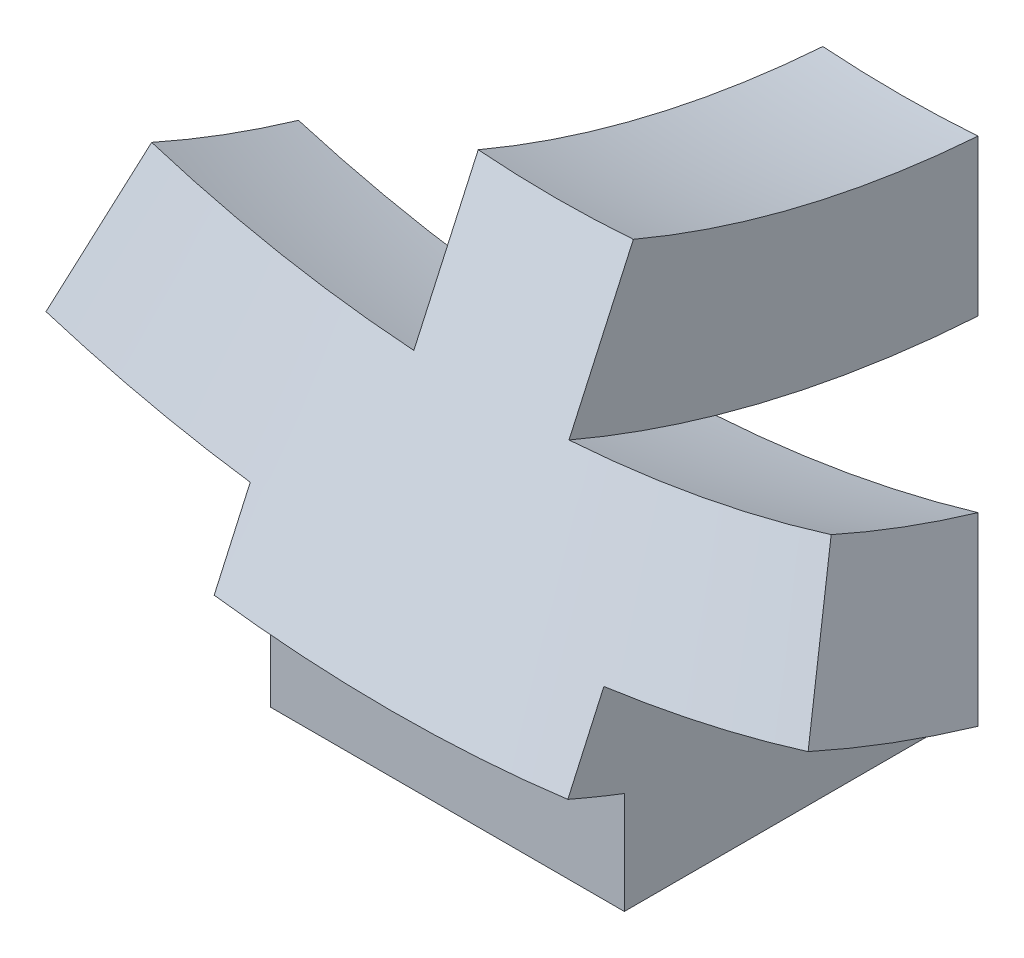
ISO-10303-21;
HEADER;
FILE_DESCRIPTION(('STEP AP214'),'2;1');
FILE_NAME('part.step','',(''),(''),'','','');
FILE_SCHEMA(('AUTOMOTIVE_DESIGN { 1 0 10303 214 1 1 1 1 }'));
ENDSEC;
DATA;
#1=APPLICATION_CONTEXT('core data for automotive mechanical design processes');
#2=APPLICATION_PROTOCOL_DEFINITION('international standard','automotive_design',2000,#1);
#3=PRODUCT_CONTEXT('',#1,'mechanical');
#4=PRODUCT('Part','Part','',(#3));
#5=PRODUCT_RELATED_PRODUCT_CATEGORY('part','',(#4));
#6=PRODUCT_DEFINITION_FORMATION('','',#4);
#7=PRODUCT_DEFINITION_CONTEXT('part definition',#1,'design');
#8=PRODUCT_DEFINITION('design','',#6,#7);
#9=PRODUCT_DEFINITION_SHAPE('','',#8);
#10=(LENGTH_UNIT() NAMED_UNIT(*) SI_UNIT(.MILLI.,.METRE.));
#11=(NAMED_UNIT(*) PLANE_ANGLE_UNIT() SI_UNIT($,.RADIAN.));
#12=(NAMED_UNIT(*) SI_UNIT($,.STERADIAN.) SOLID_ANGLE_UNIT());
#13=UNCERTAINTY_MEASURE_WITH_UNIT(LENGTH_MEASURE(1.E-05),#10,'distance_accuracy_value','');
#14=(GEOMETRIC_REPRESENTATION_CONTEXT(3) GLOBAL_UNCERTAINTY_ASSIGNED_CONTEXT((#13)) GLOBAL_UNIT_ASSIGNED_CONTEXT((#10,
#11,#12)) REPRESENTATION_CONTEXT('',''));
#15=CARTESIAN_POINT('',(0.,0.,0.));
#16=DIRECTION('',(0.,0.,1.));
#17=DIRECTION('',(1.,0.,0.));
#18=AXIS2_PLACEMENT_3D('',#15,#16,#17);
#19=CARTESIAN_POINT('',(0.,0.,0.));
#20=DIRECTION('',(0.,0.,1.));
#21=DIRECTION('',(1.,0.,0.));
#22=AXIS2_PLACEMENT_3D('',#19,#20,#21);
#23=SPHERICAL_SURFACE('',#22,30.7476736735782);
#24=CARTESIAN_POINT('',(-3.8947960584419,0.,0.));
#25=DIRECTION('',(-1.,0.,0.));
#26=DIRECTION('',(0.,-1.,0.));
#27=AXIS2_PLACEMENT_3D('',#24,#25,#26);
#28=CIRCLE('',#27,30.5);
#29=CARTESIAN_POINT('',(-3.89479605844179,-30.2502985714711,3.8947960584418));
#30=VERTEX_POINT('',#29);
#31=CARTESIAN_POINT('',(-3.8947960584418,-29.3224571664811,8.39306295221711));
#32=VERTEX_POINT('',#31);
#33=EDGE_CURVE('E49',#30,#32,#28,.T.);
#34=ORIENTED_EDGE('',*,*,#33,.T.);
#35=CARTESIAN_POINT('',(0.,0.,8.39306295221722));
#36=DIRECTION('',(0.,0.,1.));
#37=DIRECTION('',(-1.,0.,0.));
#38=AXIS2_PLACEMENT_3D('',#35,#36,#37);
#39=CIRCLE('',#38,29.5799920658706);
#40=CARTESIAN_POINT('',(3.894796058442,-29.3224571664811,8.39306295221711));
#41=VERTEX_POINT('',#40);
#42=EDGE_CURVE('E143',#32,#41,#39,.T.);
#43=ORIENTED_EDGE('',*,*,#42,.T.);
#44=CARTESIAN_POINT('',(3.8947960584419,0.,0.));
#45=DIRECTION('',(-1.,0.,0.));
#46=DIRECTION('',(0.,-1.,0.));
#47=AXIS2_PLACEMENT_3D('',#44,#45,#46);
#48=CIRCLE('',#47,30.5);
#49=CARTESIAN_POINT('',(3.894796058442,-30.250298571471,3.8947960584418));
#50=VERTEX_POINT('',#49);
#51=EDGE_CURVE('E57',#50,#41,#48,.T.);
#52=ORIENTED_EDGE('',*,*,#51,.F.);
#53=CARTESIAN_POINT('',(0.,0.,3.8947960584419));
#54=DIRECTION('',(0.,0.,1.));
#55=DIRECTION('',(-1.,0.,0.));
#56=AXIS2_PLACEMENT_3D('',#53,#54,#55);
#57=CIRCLE('',#56,30.5);
#58=EDGE_CURVE('E41',#30,#50,#57,.T.);
#59=ORIENTED_EDGE('',*,*,#58,.F.);
#60=EDGE_LOOP('',(#34,#43,#52,#59));
#61=FACE_BOUND('',#60,.T.);
#62=ADVANCED_FACE('F37',(#61),#23,.F.);
#63=CARTESIAN_POINT('',(32.4999999999999,0.,3.894796058442));
#64=DIRECTION('',(0.,0.,1.));
#65=DIRECTION('',(-1.,0.,0.));
#66=AXIS2_PLACEMENT_3D('',#63,#64,#65);
#67=PLANE('',#66);
#68=DIRECTION('',(-1.,0.,0.));
#69=VECTOR('',#68,1.);
#70=CARTESIAN_POINT('',(-32.5,-32.5,3.89479605844188));
#71=LINE('',#70,#69);
#72=CARTESIAN_POINT('',(3.8947960584421,-32.5,3.8947960584418));
#73=VERTEX_POINT('',#72);
#74=CARTESIAN_POINT('',(-3.89479605844188,-32.5,3.8947960584418));
#75=VERTEX_POINT('',#74);
#76=EDGE_CURVE('E218',#73,#75,#71,.T.);
#77=ORIENTED_EDGE('',*,*,#76,.T.);
#78=DIRECTION('',(0.,-1.,0.));
#79=VECTOR('',#78,1.);
#80=CARTESIAN_POINT('',(-3.89479605844199,-1.45716771982052E-13,3.89479605844199));
#81=LINE('',#80,#79);
#82=EDGE_CURVE('E201',#30,#75,#81,.T.);
#83=ORIENTED_EDGE('',*,*,#82,.F.);
#84=ORIENTED_EDGE('',*,*,#58,.T.);
#85=DIRECTION('',(0.,1.,0.));
#86=VECTOR('',#85,1.);
#87=CARTESIAN_POINT('',(3.89479605844199,-1.17961196366423E-13,3.894796058442));
#88=LINE('',#87,#86);
#89=EDGE_CURVE('E358',#73,#50,#88,.T.);
#90=ORIENTED_EDGE('',*,*,#89,.F.);
#91=EDGE_LOOP('',(#77,#83,#84,#90));
#92=FACE_BOUND('',#91,.T.);
#93=ADVANCED_FACE('F265',(#92),#67,.F.);
#94=CARTESIAN_POINT('',(0.,0.,7.48329222234973));
#95=DIRECTION('',(0.,0.,1.));
#96=DIRECTION('',(-1.,0.,0.));
#97=AXIS2_PLACEMENT_3D('',#94,#95,#96);
#98=CONICAL_SURFACE('',#97,26.2857240675938,1.30134475047002);
#99=CARTESIAN_POINT('',(0.,0.,7.48329222234973));
#100=DIRECTION('',(0.,0.,1.));
#101=DIRECTION('',(-1.,0.,0.));
#102=AXIS2_PLACEMENT_3D('',#99,#100,#101);
#103=CIRCLE('',#102,26.2857240675938);
#104=CARTESIAN_POINT('',(-7.48329222234964,-25.1980083989311,7.48329222234964));
#105=VERTEX_POINT('',#104);
#106=CARTESIAN_POINT('',(-1.70874488464016,-26.2301254415014,7.48329222234964));
#107=VERTEX_POINT('',#106);
#108=EDGE_CURVE('E139',#105,#107,#103,.T.);
#109=ORIENTED_EDGE('',*,*,#108,.T.);
#110=CARTESIAN_POINT('',(1.70874488464034,-26.2301254415014,7.48329222234964));
#111=VERTEX_POINT('',#110);
#112=EDGE_CURVE('E142',#107,#111,#103,.T.);
#113=ORIENTED_EDGE('',*,*,#112,.T.);
#114=CARTESIAN_POINT('',(7.48329222234981,-25.1980083989311,7.48329222234964));
#115=VERTEX_POINT('',#114);
#116=EDGE_CURVE('E140',#111,#115,#103,.T.);
#117=ORIENTED_EDGE('',*,*,#116,.T.);
#118=CARTESIAN_POINT('',(8.39326295221731,-28.3649768493335,8.39326295221712));
#119=CARTESIAN_POINT('',(8.24156724531615,-27.837033100136,8.24156724531596));
#120=CARTESIAN_POINT('',(8.08987183104328,-27.3090891827758,8.08987183104309));
#121=CARTESIAN_POINT('',(7.78648158775411,-26.2532010117296,7.78648158775393));
#122=CARTESIAN_POINT('',(7.63478675873782,-25.7252567580436,7.63478675873764));
#123=CARTESIAN_POINT('',(7.48309222234982,-25.1973123361948,7.48309222234965));
#124=B_SPLINE_CURVE_WITH_KNOTS('',3,(#118,#119,#120,#121,#122,#123),.UNSPECIFIED.,.F.,.F.,(4,2,
4),(0.,1.70959936701698,3.41919873403409),.UNSPECIFIED.);
#125=CARTESIAN_POINT('',(8.39306295221731,-28.3642807928756,8.39306295221712));
#126=VERTEX_POINT('',#125);
#127=EDGE_CURVE('E202',#126,#115,#124,.T.);
#128=ORIENTED_EDGE('',*,*,#127,.F.);
#129=EDGE_CURVE('E151',#41,#126,#39,.T.);
#130=ORIENTED_EDGE('',*,*,#129,.F.);
#131=ORIENTED_EDGE('',*,*,#42,.F.);
#132=CARTESIAN_POINT('',(-8.39306295221712,-28.3642807928756,8.39306295221711));
#133=VERTEX_POINT('',#132);
#134=EDGE_CURVE('E152',#133,#32,#39,.T.);
#135=ORIENTED_EDGE('',*,*,#134,.F.);
#136=CARTESIAN_POINT('',(-7.48309222234964,-25.1973123361948,7.48309222234964));
#137=CARTESIAN_POINT('',(-7.63478675873763,-25.7252567580436,7.63478675873763));
#138=CARTESIAN_POINT('',(-7.78648158775392,-26.2532010117296,7.78648158775392));
#139=CARTESIAN_POINT('',(-8.08987183104308,-27.3090891827758,8.08987183104308));
#140=CARTESIAN_POINT('',(-8.24156724531595,-27.8370331001361,8.24156724531595));
#141=CARTESIAN_POINT('',(-8.39326295221711,-28.3649768493335,8.39326295221711));
#142=B_SPLINE_CURVE_WITH_KNOTS('',3,(#136,#137,#138,#139,#140,#141),.UNSPECIFIED.,.F.,.F.,(4,2,
4),(0.,1.7095993670171,3.41919873403409),.UNSPECIFIED.);
#143=EDGE_CURVE('E165',#105,#133,#142,.T.);
#144=ORIENTED_EDGE('',*,*,#143,.F.);
#145=EDGE_LOOP('',(#109,#113,#117,#128,#130,#131,#135,#144));
#146=FACE_BOUND('',#145,.T.);
#147=ADVANCED_FACE('F158',(#146),#98,.T.);
#148=CARTESIAN_POINT('',(0.,0.,0.));
#149=DIRECTION('',(0.,0.,1.));
#150=DIRECTION('',(1.,0.,0.));
#151=AXIS2_PLACEMENT_3D('',#148,#149,#150);
#152=SPHERICAL_SURFACE('',#151,27.3301839042982);
#153=CARTESIAN_POINT('',(0.,0.,1.70874488464027));
#154=DIRECTION('',(0.,0.,1.));
#155=DIRECTION('',(-1.,0.,0.));
#156=AXIS2_PLACEMENT_3D('',#153,#154,#155);
#157=CIRCLE('',#156,27.276714302899);
#158=CARTESIAN_POINT('',(-1.70874488464015,-27.2231396808155,1.70874488464017));
#159=VERTEX_POINT('',#158);
#160=CARTESIAN_POINT('',(1.70874488464035,-27.2231396808155,1.70874488464017));
#161=VERTEX_POINT('',#160);
#162=EDGE_CURVE('E137',#159,#161,#157,.T.);
#163=ORIENTED_EDGE('',*,*,#162,.T.);
#164=CARTESIAN_POINT('',(1.70874488464026,0.,0.));
#165=DIRECTION('',(1.,0.,0.));
#166=DIRECTION('',(0.,1.,0.));
#167=AXIS2_PLACEMENT_3D('',#164,#165,#166);
#168=CIRCLE('',#167,27.2767143028991);
#169=EDGE_CURVE('E183',#111,#161,#168,.T.);
#170=ORIENTED_EDGE('',*,*,#169,.F.);
#171=ORIENTED_EDGE('',*,*,#112,.F.);
#172=CARTESIAN_POINT('',(-1.70874488464026,0.,0.));
#173=DIRECTION('',(-1.,0.,0.));
#174=DIRECTION('',(0.,-1.,0.));
#175=AXIS2_PLACEMENT_3D('',#172,#173,#174);
#176=CIRCLE('',#175,27.2767143028991);
#177=EDGE_CURVE('E173',#159,#107,#176,.T.);
#178=ORIENTED_EDGE('',*,*,#177,.F.);
#179=EDGE_LOOP('',(#163,#170,#171,#178));
#180=FACE_BOUND('',#179,.T.);
#181=ADVANCED_FACE('F186',(#180),#152,.T.);
#182=CARTESIAN_POINT('',(23.8515645548495,0.,1.70874488464026));
#183=DIRECTION('',(0.,0.,1.));
#184=DIRECTION('',(-1.,0.,0.));
#185=AXIS2_PLACEMENT_3D('',#182,#183,#184);
#186=PLANE('',#185);
#187=CARTESIAN_POINT('',(0.,0.,1.70874488464023));
#188=DIRECTION('',(0.,0.,1.));
#189=DIRECTION('',(-1.,0.,0.));
#190=AXIS2_PLACEMENT_3D('',#187,#188,#189);
#191=CIRCLE('',#190,23.8515645548495);
#192=CARTESIAN_POINT('',(-1.70874488464015,-23.7902779015582,1.70874488464015));
#193=VERTEX_POINT('',#192);
#194=CARTESIAN_POINT('',(1.70874488464033,-23.7902779015582,1.70874488464015));
#195=VERTEX_POINT('',#194);
#196=EDGE_CURVE('E126',#193,#195,#191,.T.);
#197=ORIENTED_EDGE('',*,*,#196,.T.);
#198=DIRECTION('',(0.,1.,0.));
#199=VECTOR('',#198,1.);
#200=CARTESIAN_POINT('',(1.70874488464026,0.,1.70874488464025));
#201=LINE('',#200,#199);
#202=EDGE_CURVE('E184',#161,#195,#201,.T.);
#203=ORIENTED_EDGE('',*,*,#202,.F.);
#204=ORIENTED_EDGE('',*,*,#162,.F.);
#205=DIRECTION('',(0.,-1.,0.));
#206=VECTOR('',#205,1.);
#207=CARTESIAN_POINT('',(-1.70874488464025,-1.07552855510562E-13,1.70874488464026));
#208=LINE('',#207,#206);
#209=EDGE_CURVE('E113',#193,#159,#208,.T.);
#210=ORIENTED_EDGE('',*,*,#209,.F.);
#211=EDGE_LOOP('',(#197,#203,#204,#210));
#212=FACE_BOUND('',#211,.T.);
#213=ADVANCED_FACE('F250',(#212),#186,.F.);
#214=CARTESIAN_POINT('',(3.89479605844189,32.5,0.));
#215=DIRECTION('',(1.,0.,0.));
#216=DIRECTION('',(0.,-1.,0.));
#217=AXIS2_PLACEMENT_3D('',#214,#215,#216);
#218=PLANE('',#217);
#219=DIRECTION('',(0.,0.,1.));
#220=VECTOR('',#219,1.);
#221=CARTESIAN_POINT('',(3.8947960584421,-32.5,-32.5));
#222=LINE('',#221,#220);
#223=CARTESIAN_POINT('',(3.8947960584421,-32.5,11.6843881753259));
#224=VERTEX_POINT('',#223);
#225=EDGE_CURVE('E215',#73,#224,#222,.T.);
#226=ORIENTED_EDGE('',*,*,#225,.F.);
#227=ORIENTED_EDGE('',*,*,#89,.T.);
#228=ORIENTED_EDGE('',*,*,#51,.T.);
#229=CARTESIAN_POINT('',(3.89479605844209,-27.9819524685902,12.1350869813756));
#230=VERTEX_POINT('',#229);
#231=EDGE_CURVE('E193',#41,#230,#48,.T.);
#232=ORIENTED_EDGE('',*,*,#231,.T.);
#233=CARTESIAN_POINT('',(3.89479605844211,-35.5699771913844,15.5675463428578));
#234=CARTESIAN_POINT('',(3.89479605844211,-34.2887705066438,14.9870911520035));
#235=CARTESIAN_POINT('',(3.8947960584421,-33.0074458102986,14.4068959176564));
#236=CARTESIAN_POINT('',(3.89479605844209,-30.4444005461586,13.2473845634315));
#237=CARTESIAN_POINT('',(3.89479605844209,-29.1626799788237,12.6680684425369));
#238=CARTESIAN_POINT('',(3.89479605844208,-26.5986790761798,11.5106726823728));
#239=CARTESIAN_POINT('',(3.89479605844208,-25.3163987403988,10.932593044148));
#240=CARTESIAN_POINT('',(3.89479605844207,-23.3923252593334,10.0669226868517));
#241=CARTESIAN_POINT('',(3.89479605844207,-22.750858232874,9.7786072520183));
#242=CARTESIAN_POINT('',(3.89479605844206,-21.4676400043882,9.20260894604725));
#243=CARTESIAN_POINT('',(3.89479605844206,-20.8258888022637,8.91492607512798));
#244=CARTESIAN_POINT('',(3.89479605844206,-20.1839623525351,8.62763429495572));
#245=B_SPLINE_CURVE_WITH_KNOTS('',3,(#233,#234,#235,#236,#237,#238,#239,#240,#241,#242,#243,
#244),.UNSPECIFIED.,.F.,.F.,(4,2,2,2,2,4),(0.,4.2196885581347,8.43937223157967,12.6590594690262,
14.7689055196008,16.878752298504),.UNSPECIFIED.);
#246=CARTESIAN_POINT('',(3.89479605844209,-29.7396392780992,12.929011806916));
#247=VERTEX_POINT('',#246);
#248=EDGE_CURVE('E129',#247,#230,#245,.T.);
#249=ORIENTED_EDGE('',*,*,#248,.F.);
#250=CARTESIAN_POINT('',(3.89479605844199,0.,0.));
#251=DIRECTION('',(1.,0.,0.));
#252=DIRECTION('',(0.,1.,0.));
#253=AXIS2_PLACEMENT_3D('',#250,#251,#252);
#254=CIRCLE('',#253,32.4284672887085);
#255=CARTESIAN_POINT('',(3.89479605844209,-30.250298571471,11.6843881753259));
#256=VERTEX_POINT('',#255);
#257=EDGE_CURVE('E105',#256,#247,#254,.F.);
#258=ORIENTED_EDGE('',*,*,#257,.F.);
#259=DIRECTION('',(0.,1.,0.));
#260=VECTOR('',#259,1.);
#261=CARTESIAN_POINT('',(3.89479605844199,-1.45716771982052E-13,11.6843881753261));
#262=LINE('',#261,#260);
#263=EDGE_CURVE('E117',#224,#256,#262,.T.);
#264=ORIENTED_EDGE('',*,*,#263,.F.);
#265=EDGE_LOOP('',(#226,#227,#228,#232,#249,#258,#264));
#266=FACE_BOUND('',#265,.T.);
#267=ADVANCED_FACE('F128',(#266),#218,.T.);
#268=CARTESIAN_POINT('',(-3.89479605844211,32.5,0.));
#269=DIRECTION('',(-1.,0.,0.));
#270=DIRECTION('',(0.,-1.,0.));
#271=AXIS2_PLACEMENT_3D('',#268,#269,#270);
#272=PLANE('',#271);
#273=DIRECTION('',(0.,0.,-1.));
#274=VECTOR('',#273,1.);
#275=CARTESIAN_POINT('',(-3.89479605844188,-32.5,-32.5));
#276=LINE('',#275,#274);
#277=CARTESIAN_POINT('',(-3.89479605844188,-32.5,11.6843881753259));
#278=VERTEX_POINT('',#277);
#279=EDGE_CURVE('E217',#278,#75,#276,.T.);
#280=ORIENTED_EDGE('',*,*,#279,.F.);
#281=DIRECTION('',(0.,-1.,0.));
#282=VECTOR('',#281,1.);
#283=CARTESIAN_POINT('',(-3.89479605844199,-1.73472347597681E-13,11.6843881753261));
#284=LINE('',#283,#282);
#285=CARTESIAN_POINT('',(-3.89479605844188,-30.250298571471,11.6843881753259));
#286=VERTEX_POINT('',#285);
#287=EDGE_CURVE('E125',#286,#278,#284,.T.);
#288=ORIENTED_EDGE('',*,*,#287,.F.);
#289=CARTESIAN_POINT('',(-3.89479605844199,0.,0.));
#290=DIRECTION('',(-1.,0.,0.));
#291=DIRECTION('',(0.,-1.,0.));
#292=AXIS2_PLACEMENT_3D('',#289,#290,#291);
#293=CIRCLE('',#292,32.4284672887085);
#294=CARTESIAN_POINT('',(-3.89479605844189,-29.7396392780993,12.929011806916));
#295=VERTEX_POINT('',#294);
#296=EDGE_CURVE('E109',#295,#286,#293,.F.);
#297=ORIENTED_EDGE('',*,*,#296,.F.);
#298=CARTESIAN_POINT('',(-3.89479605844192,-20.1839623525352,8.62763429495573));
#299=CARTESIAN_POINT('',(-3.89479605844192,-20.8258888022637,8.91492607512799));
#300=CARTESIAN_POINT('',(-3.89479605844191,-21.4676400043882,9.20260894604726));
#301=CARTESIAN_POINT('',(-3.89479605844191,-22.7508582328741,9.77860725201831));
#302=CARTESIAN_POINT('',(-3.89479605844191,-23.3923252593334,10.0669226868517));
#303=CARTESIAN_POINT('',(-3.8947960584419,-25.3163987403989,10.932593044148));
#304=CARTESIAN_POINT('',(-3.8947960584419,-26.5986790761798,11.5106726823728));
#305=CARTESIAN_POINT('',(-3.89479605844189,-29.1626799788237,12.6680684425369));
#306=CARTESIAN_POINT('',(-3.89479605844188,-30.4444005461586,13.2473845634315));
#307=CARTESIAN_POINT('',(-3.89479605844187,-33.0074458102986,14.4068959176563));
#308=CARTESIAN_POINT('',(-3.89479605844187,-34.2887705066438,14.9870911520035));
#309=CARTESIAN_POINT('',(-3.89479605844186,-35.5699771913844,15.5675463428578));
#310=B_SPLINE_CURVE_WITH_KNOTS('',3,(#298,#299,#300,#301,#302,#303,#304,#305,#306,#307,#308,
#309),.UNSPECIFIED.,.F.,.F.,(4,2,2,2,2,4),(0.,2.10984677890311,4.2196928294777,8.43938006692425,
12.6590637403692,16.8787522985039),.UNSPECIFIED.);
#311=CARTESIAN_POINT('',(-3.8947960584418,-27.9819524685903,12.1350869813756));
#312=VERTEX_POINT('',#311);
#313=EDGE_CURVE('E225',#312,#295,#310,.T.);
#314=ORIENTED_EDGE('',*,*,#313,.F.);
#315=EDGE_CURVE('E11',#32,#312,#28,.T.);
#316=ORIENTED_EDGE('',*,*,#315,.F.);
#317=ORIENTED_EDGE('',*,*,#33,.F.);
#318=ORIENTED_EDGE('',*,*,#82,.T.);
#319=EDGE_LOOP('',(#280,#288,#297,#314,#316,#317,#318));
#320=FACE_BOUND('',#319,.T.);
#321=ADVANCED_FACE('F239',(#320),#272,.T.);
#322=CARTESIAN_POINT('',(32.4999999999999,0.,11.6843881753261));
#323=DIRECTION('',(0.,0.,1.));
#324=DIRECTION('',(-1.,0.,0.));
#325=AXIS2_PLACEMENT_3D('',#322,#323,#324);
#326=PLANE('',#325);
#327=DIRECTION('',(-1.,0.,0.));
#328=VECTOR('',#327,1.);
#329=CARTESIAN_POINT('',(-32.5,-32.5,11.684388175326));
#330=LINE('',#329,#328);
#331=EDGE_CURVE('E121',#224,#278,#330,.T.);
#332=ORIENTED_EDGE('',*,*,#331,.F.);
#333=ORIENTED_EDGE('',*,*,#263,.T.);
#334=CARTESIAN_POINT('',(0.,0.,11.684388175326));
#335=DIRECTION('',(0.,0.,1.));
#336=DIRECTION('',(-1.,0.,0.));
#337=AXIS2_PLACEMENT_3D('',#334,#335,#336);
#338=CIRCLE('',#337,30.4999999999999);
#339=EDGE_CURVE('E101',#286,#256,#338,.T.);
#340=ORIENTED_EDGE('',*,*,#339,.F.);
#341=ORIENTED_EDGE('',*,*,#287,.T.);
#342=EDGE_LOOP('',(#332,#333,#340,#341));
#343=FACE_BOUND('',#342,.T.);
#344=ADVANCED_FACE('F118',(#343),#326,.T.);
#345=CARTESIAN_POINT('',(0.,0.,0.));
#346=DIRECTION('',(0.,0.,1.));
#347=DIRECTION('',(1.,0.,0.));
#348=AXIS2_PLACEMENT_3D('',#345,#346,#347);
#349=SPHERICAL_SURFACE('',#348,32.6615205866428);
#350=CARTESIAN_POINT('',(0.,0.,12.9290118069161));
#351=DIRECTION('',(0.,0.,1.));
#352=DIRECTION('',(-1.,0.,0.));
#353=AXIS2_PLACEMENT_3D('',#350,#351,#352);
#354=CIRCLE('',#353,29.9935923278342);
#355=EDGE_CURVE('E95',#295,#247,#354,.T.);
#356=ORIENTED_EDGE('',*,*,#355,.F.);
#357=ORIENTED_EDGE('',*,*,#296,.T.);
#358=ORIENTED_EDGE('',*,*,#339,.T.);
#359=ORIENTED_EDGE('',*,*,#257,.T.);
#360=EDGE_LOOP('',(#356,#357,#358,#359));
#361=FACE_BOUND('',#360,.T.);
#362=ADVANCED_FACE('F103',(#361),#349,.T.);
#363=CARTESIAN_POINT('',(0.,0.,9.29948381331429));
#364=DIRECTION('',(0.,0.,1.));
#365=DIRECTION('',(-1.,0.,0.));
#366=AXIS2_PLACEMENT_3D('',#363,#364,#365);
#367=CONICAL_SURFACE('',#366,22.0303550039677,1.14314161659707);
#368=CARTESIAN_POINT('',(0.,0.,12.1350869813757));
#369=DIRECTION('',(0.,0.,-1.));
#370=DIRECTION('',(0.,1.,0.));
#371=AXIS2_PLACEMENT_3D('',#368,#369,#370);
#372=CIRCLE('',#371,28.2517096879339);
#373=CARTESIAN_POINT('',(-8.39306295221712,-26.9762042283828,12.1350869813756));
#374=VERTEX_POINT('',#373);
#375=EDGE_CURVE('E233',#374,#312,#372,.F.);
#376=ORIENTED_EDGE('',*,*,#375,.T.);
#377=ORIENTED_EDGE('',*,*,#313,.T.);
#378=ORIENTED_EDGE('',*,*,#355,.T.);
#379=ORIENTED_EDGE('',*,*,#248,.T.);
#380=CARTESIAN_POINT('',(0.,0.,12.1350869813757));
#381=DIRECTION('',(0.,0.,-1.));
#382=DIRECTION('',(0.,1.,0.));
#383=AXIS2_PLACEMENT_3D('',#380,#381,#382);
#384=CIRCLE('',#383,28.2517096879339);
#385=CARTESIAN_POINT('',(8.3930629522173,-26.9762042283828,12.1350869813757));
#386=VERTEX_POINT('',#385);
#387=EDGE_CURVE('E310',#230,#386,#384,.F.);
#388=ORIENTED_EDGE('',*,*,#387,.T.);
#389=CARTESIAN_POINT('',(8.39326295221731,-26.9768581268495,12.1353986441368));
#390=CARTESIAN_POINT('',(8.24156328674954,-26.4808781488639,11.8990033389354));
#391=CARTESIAN_POINT('',(8.08986589319345,-25.9848974028045,11.6626081873431));
#392=CARTESIAN_POINT('',(7.78647564990428,-24.9929343745373,11.1898181913765));
#393=CARTESIAN_POINT('',(7.63478280017122,-24.4969520923294,10.9534233470022));
#394=CARTESIAN_POINT('',(7.48309222234982,-24.0009690420478,10.7170286562372));
#395=B_SPLINE_CURVE_WITH_KNOTS('',3,(#389,#390,#391,#392,#393,#394),.UNSPECIFIED.,.F.,.F.,(4,2,
4),(0.,1.70997807188481,3.4199561437732),.UNSPECIFIED.);
#396=CARTESIAN_POINT('',(7.48329222234981,-24.0016229838808,10.7173403369178));
#397=VERTEX_POINT('',#396);
#398=EDGE_CURVE('E301',#386,#397,#395,.T.);
#399=ORIENTED_EDGE('',*,*,#398,.T.);
#400=CARTESIAN_POINT('',(0.,0.,10.7173403369179));
#401=DIRECTION('',(0.,0.,-1.));
#402=DIRECTION('',(0.,1.,0.));
#403=AXIS2_PLACEMENT_3D('',#400,#401,#402);
#404=CIRCLE('',#403,25.1411528841745);
#405=CARTESIAN_POINT('',(1.70874488464035,-25.0830173476927,10.7173403369178));
#406=VERTEX_POINT('',#405);
#407=EDGE_CURVE('E309',#397,#406,#404,.T.);
#408=ORIENTED_EDGE('',*,*,#407,.T.);
#409=CARTESIAN_POINT('',(1.70874488464037,-34.9607896136189,15.2120097278827));
#410=CARTESIAN_POINT('',(1.70874488464036,-33.10238377832,14.3660313579576));
#411=CARTESIAN_POINT('',(1.70874488464036,-31.2439486676821,13.5201170489047));
#412=CARTESIAN_POINT('',(1.70874488464035,-27.5268676857756,11.8287533360433));
#413=CARTESIAN_POINT('',(1.70874488464034,-25.6682218145793,10.9833039320763));
#414=CARTESIAN_POINT('',(1.70874488464033,-22.8799793916311,9.7157304605916));
#415=CARTESIAN_POINT('',(1.70874488464033,-21.9505194295402,9.29330597665969));
#416=CARTESIAN_POINT('',(1.70874488464032,-20.0914624460492,8.44875889267132));
#417=CARTESIAN_POINT('',(1.70874488464032,-19.1618654246604,8.02663629259021));
#418=CARTESIAN_POINT('',(1.70874488464031,-17.3024651297723,7.18284448846468));
#419=CARTESIAN_POINT('',(1.70874488464031,-16.3726618561919,6.76117528459889));
#420=CARTESIAN_POINT('',(1.7087448846403,-14.9777033655113,6.1292308247543));
#421=CARTESIAN_POINT('',(1.7087448846403,-14.5126748754532,5.91867586726803));
#422=CARTESIAN_POINT('',(1.7087448846403,-13.5825022899433,5.49782134100688));
#423=CARTESIAN_POINT('',(1.7087448846403,-13.1173581944785,5.28752177226067));
#424=CARTESIAN_POINT('',(1.7087448846403,-12.6521407882196,5.07738438199863));
#425=B_SPLINE_CURVE_WITH_KNOTS('',3,(#409,#410,#411,#412,#413,#414,#415,#416,#417,#418,#419,
#420,#421,#422,#423,#424),.UNSPECIFIED.,.F.,.F.,(4,2,2,2,2,2,2,4),(0.,6.1256972631318,
12.2513924350887,15.3142414603475,18.3770902354796,21.4399402167957,22.9713656230254,
24.5027912012691),.UNSPECIFIED.);
#426=CARTESIAN_POINT('',(1.70874488464029,-21.9639871726438,9.29948381331421));
#427=VERTEX_POINT('',#426);
#428=EDGE_CURVE('E388',#406,#427,#425,.T.);
#429=ORIENTED_EDGE('',*,*,#428,.T.);
#430=CARTESIAN_POINT('',(0.,0.,9.29948381331429));
#431=DIRECTION('',(0.,0.,1.));
#432=DIRECTION('',(-1.,0.,0.));
#433=AXIS2_PLACEMENT_3D('',#430,#431,#432);
#434=CIRCLE('',#433,22.0303550039677);
#435=CARTESIAN_POINT('',(-1.70874488464014,-21.9639871726438,9.29948381331421));
#436=VERTEX_POINT('',#435);
#437=EDGE_CURVE('E213',#436,#427,#434,.T.);
#438=ORIENTED_EDGE('',*,*,#437,.F.);
#439=CARTESIAN_POINT('',(-1.70874488464021,-12.6521407882196,5.07738438199864));
#440=CARTESIAN_POINT('',(-1.70874488464021,-13.1597969243468,5.30669285098874));
#441=CARTESIAN_POINT('',(-1.70874488464021,-13.6673666083887,5.53619255078423));
#442=CARTESIAN_POINT('',(-1.7087448846402,-14.6823717085895,5.99548851776416));
#443=CARTESIAN_POINT('',(-1.7087448846402,-15.1898071247657,6.22528478491007));
#444=CARTESIAN_POINT('',(-1.70874488464019,-16.7119698299383,6.91498955241901));
#445=CARTESIAN_POINT('',(-1.70874488464019,-17.7265538694199,7.37521415170118));
#446=CARTESIAN_POINT('',(-1.70874488464018,-19.7554963258305,8.29615918661268));
#447=CARTESIAN_POINT('',(-1.70874488464018,-20.7698547428497,8.75687962204344));
#448=CARTESIAN_POINT('',(-1.70874488464017,-22.7984253407834,9.67864252950293));
#449=CARTESIAN_POINT('',(-1.70874488464017,-23.8126375216856,10.1396850015589));
#450=CARTESIAN_POINT('',(-1.70874488464016,-26.5159982620799,11.3689253176521));
#451=CARTESIAN_POINT('',(-1.70874488464015,-28.20506115412,12.1373115425921));
#452=CARTESIAN_POINT('',(-1.70874488464014,-31.5830227931985,13.6744460075011));
#453=CARTESIAN_POINT('',(-1.70874488464013,-33.2719215401902,14.443194247573));
#454=CARTESIAN_POINT('',(-1.70874488464013,-34.9607896136189,15.2120097278827));
#455=B_SPLINE_CURVE_WITH_KNOTS('',3,(#439,#440,#441,#442,#443,#444,#445,#446,#447,#448,#449,
#450,#451,#452,#453,#454),.UNSPECIFIED.,.F.,.F.,(4,2,2,2,2,2,2,4),(0.,1.67112946360559,
3.34225871017016,6.68451623586924,10.0267724234761,13.369028893502,18.9359092532577,
24.502791195102),.UNSPECIFIED.);
#456=CARTESIAN_POINT('',(-1.70874488464016,-25.0830173476927,10.7173403369178));
#457=VERTEX_POINT('',#456);
#458=EDGE_CURVE('E376',#436,#457,#455,.T.);
#459=ORIENTED_EDGE('',*,*,#458,.T.);
#460=CARTESIAN_POINT('',(0.,0.,10.7173403369179));
#461=DIRECTION('',(0.,0.,-1.));
#462=DIRECTION('',(0.,1.,0.));
#463=AXIS2_PLACEMENT_3D('',#460,#461,#462);
#464=CIRCLE('',#463,25.1411528841745);
#465=CARTESIAN_POINT('',(-7.48329222234964,-24.0016229838809,10.7173403369178));
#466=VERTEX_POINT('',#465);
#467=EDGE_CURVE('E191',#457,#466,#464,.T.);
#468=ORIENTED_EDGE('',*,*,#467,.T.);
#469=CARTESIAN_POINT('',(-7.48309222234964,-24.0009690420478,10.7170286562371));
#470=CARTESIAN_POINT('',(-7.63478280017103,-24.4969520923294,10.9534233470022));
#471=CARTESIAN_POINT('',(-7.78647564990409,-24.9929343745373,11.1898181913765));
#472=CARTESIAN_POINT('',(-8.08986589319325,-25.9848974028045,11.6626081873431));
#473=CARTESIAN_POINT('',(-8.24156328674934,-26.4808781488639,11.8990033389353));
#474=CARTESIAN_POINT('',(-8.39326295221711,-26.9768581268495,12.1353986441368));
#475=B_SPLINE_CURVE_WITH_KNOTS('',3,(#469,#470,#471,#472,#473,#474),.UNSPECIFIED.,.F.,.F.,(4,2,
4),(0.,1.70997807188839,3.41995614377319),.UNSPECIFIED.);
#476=EDGE_CURVE('E375',#466,#374,#475,.T.);
#477=ORIENTED_EDGE('',*,*,#476,.T.);
#478=EDGE_LOOP('',(#376,#377,#378,#379,#388,#399,#408,#429,#438,#459,#468,#477));
#479=FACE_BOUND('',#478,.T.);
#480=ADVANCED_FACE('F235',(#479),#367,.F.);
#481=CARTESIAN_POINT('',(0.,0.,0.));
#482=DIRECTION('',(-1.,0.,0.));
#483=DIRECTION('',(0.,1.,0.));
#484=AXIS2_PLACEMENT_3D('',#481,#482,#483);
#485=SPHERICAL_SURFACE('',#484,30.7476736735782);
#486=ORIENTED_EDGE('',*,*,#375,.F.);
#487=CARTESIAN_POINT('',(-8.39306295221721,0.,0.));
#488=DIRECTION('',(-1.,0.,0.));
#489=DIRECTION('',(0.,-1.,0.));
#490=AXIS2_PLACEMENT_3D('',#487,#488,#489);
#491=CIRCLE('',#490,29.5799920658706);
#492=EDGE_CURVE('E47',#133,#374,#491,.T.);
#493=ORIENTED_EDGE('',*,*,#492,.F.);
#494=ORIENTED_EDGE('',*,*,#134,.T.);
#495=ORIENTED_EDGE('',*,*,#315,.T.);
#496=EDGE_LOOP('',(#486,#493,#494,#495));
#497=FACE_BOUND('',#496,.T.);
#498=ADVANCED_FACE('F254',(#497),#485,.T.);
#499=CARTESIAN_POINT('',(0.,0.,0.));
#500=DIRECTION('',(1.,0.,0.));
#501=DIRECTION('',(0.,1.,0.));
#502=AXIS2_PLACEMENT_3D('',#499,#500,#501);
#503=SPHERICAL_SURFACE('',#502,30.7476736735782);
#504=ORIENTED_EDGE('',*,*,#387,.F.);
#505=ORIENTED_EDGE('',*,*,#231,.F.);
#506=ORIENTED_EDGE('',*,*,#129,.T.);
#507=CARTESIAN_POINT('',(8.39306295221721,0.,0.));
#508=DIRECTION('',(-1.,0.,0.));
#509=DIRECTION('',(0.,-1.,0.));
#510=AXIS2_PLACEMENT_3D('',#507,#508,#509);
#511=CIRCLE('',#510,29.5799920658706);
#512=EDGE_CURVE('E196',#126,#386,#511,.T.);
#513=ORIENTED_EDGE('',*,*,#512,.T.);
#514=EDGE_LOOP('',(#504,#505,#506,#513));
#515=FACE_BOUND('',#514,.T.);
#516=ADVANCED_FACE('F249',(#515),#503,.T.);
#517=CARTESIAN_POINT('',(-7.48329222234973,0.,0.));
#518=DIRECTION('',(-1.,0.,0.));
#519=DIRECTION('',(0.,-1.,0.));
#520=AXIS2_PLACEMENT_3D('',#517,#518,#519);
#521=CONICAL_SURFACE('',#520,26.2857240675938,1.30134475047002);
#522=ORIENTED_EDGE('',*,*,#476,.F.);
#523=CARTESIAN_POINT('',(-7.48329222234973,0.,0.));
#524=DIRECTION('',(-1.,0.,0.));
#525=DIRECTION('',(0.,-1.,0.));
#526=AXIS2_PLACEMENT_3D('',#523,#524,#525);
#527=CIRCLE('',#526,26.2857240675938);
#528=EDGE_CURVE('E192',#105,#466,#527,.T.);
#529=ORIENTED_EDGE('',*,*,#528,.F.);
#530=ORIENTED_EDGE('',*,*,#143,.T.);
#531=ORIENTED_EDGE('',*,*,#492,.T.);
#532=EDGE_LOOP('',(#522,#529,#530,#531));
#533=FACE_BOUND('',#532,.T.);
#534=ADVANCED_FACE('F257',(#533),#521,.F.);
#535=CARTESIAN_POINT('',(7.48329222234973,0.,0.));
#536=DIRECTION('',(1.,0.,0.));
#537=DIRECTION('',(0.,-1.,0.));
#538=AXIS2_PLACEMENT_3D('',#535,#536,#537);
#539=CONICAL_SURFACE('',#538,26.2857240675938,1.30134475047002);
#540=ORIENTED_EDGE('',*,*,#398,.F.);
#541=ORIENTED_EDGE('',*,*,#512,.F.);
#542=ORIENTED_EDGE('',*,*,#127,.T.);
#543=CARTESIAN_POINT('',(7.48329222234973,0.,0.));
#544=DIRECTION('',(-1.,0.,0.));
#545=DIRECTION('',(0.,-1.,0.));
#546=AXIS2_PLACEMENT_3D('',#543,#544,#545);
#547=CIRCLE('',#546,26.2857240675938);
#548=EDGE_CURVE('E204',#115,#397,#547,.T.);
#549=ORIENTED_EDGE('',*,*,#548,.T.);
#550=EDGE_LOOP('',(#540,#541,#542,#549));
#551=FACE_BOUND('',#550,.T.);
#552=ADVANCED_FACE('F260',(#551),#539,.F.);
#553=CARTESIAN_POINT('',(0.,0.,0.));
#554=DIRECTION('',(1.,0.,0.));
#555=DIRECTION('',(0.,1.,0.));
#556=AXIS2_PLACEMENT_3D('',#553,#554,#555);
#557=SPHERICAL_SURFACE('',#556,27.3301839042982);
#558=ORIENTED_EDGE('',*,*,#407,.F.);
#559=ORIENTED_EDGE('',*,*,#548,.F.);
#560=ORIENTED_EDGE('',*,*,#116,.F.);
#561=CARTESIAN_POINT('',(1.70874488464027,0.,0.));
#562=DIRECTION('',(-1.,0.,0.));
#563=DIRECTION('',(0.,-1.,0.));
#564=AXIS2_PLACEMENT_3D('',#561,#562,#563);
#565=CIRCLE('',#564,27.276714302899);
#566=EDGE_CURVE('E205',#111,#406,#565,.T.);
#567=ORIENTED_EDGE('',*,*,#566,.T.);
#568=EDGE_LOOP('',(#558,#559,#560,#567));
#569=FACE_BOUND('',#568,.T.);
#570=ADVANCED_FACE('F295',(#569),#557,.F.);
#571=CARTESIAN_POINT('',(1.70874488464018,23.8515645548495,0.));
#572=DIRECTION('',(1.,0.,0.));
#573=DIRECTION('',(0.,-1.,0.));
#574=AXIS2_PLACEMENT_3D('',#571,#572,#573);
#575=PLANE('',#574);
#576=ORIENTED_EDGE('',*,*,#428,.F.);
#577=ORIENTED_EDGE('',*,*,#566,.F.);
#578=ORIENTED_EDGE('',*,*,#169,.T.);
#579=ORIENTED_EDGE('',*,*,#202,.T.);
#580=CARTESIAN_POINT('',(1.70874488464022,0.,0.));
#581=DIRECTION('',(1.,0.,0.));
#582=DIRECTION('',(0.,1.,0.));
#583=AXIS2_PLACEMENT_3D('',#580,#581,#582);
#584=CIRCLE('',#583,23.8515645548495);
#585=EDGE_CURVE('E222',#427,#195,#584,.T.);
#586=ORIENTED_EDGE('',*,*,#585,.F.);
#587=EDGE_LOOP('',(#576,#577,#578,#579,#586));
#588=FACE_BOUND('',#587,.T.);
#589=ADVANCED_FACE('F255',(#588),#575,.T.);
#590=CARTESIAN_POINT('',(0.,0.,0.));
#591=DIRECTION('',(0.,0.,1.));
#592=DIRECTION('',(1.,0.,0.));
#593=AXIS2_PLACEMENT_3D('',#590,#591,#592);
#594=SPHERICAL_SURFACE('',#593,23.9126941350183);
#595=ORIENTED_EDGE('',*,*,#196,.F.);
#596=CARTESIAN_POINT('',(-1.70874488464022,0.,0.));
#597=DIRECTION('',(-1.,0.,0.));
#598=DIRECTION('',(0.,-1.,0.));
#599=AXIS2_PLACEMENT_3D('',#596,#597,#598);
#600=CIRCLE('',#599,23.8515645548495);
#601=EDGE_CURVE('E219',#193,#436,#600,.T.);
#602=ORIENTED_EDGE('',*,*,#601,.T.);
#603=ORIENTED_EDGE('',*,*,#437,.T.);
#604=ORIENTED_EDGE('',*,*,#585,.T.);
#605=EDGE_LOOP('',(#595,#602,#603,#604));
#606=FACE_BOUND('',#605,.T.);
#607=ADVANCED_FACE('F396',(#606),#594,.F.);
#608=CARTESIAN_POINT('',(-1.70874488464034,23.8515645548495,0.));
#609=DIRECTION('',(-1.,0.,0.));
#610=DIRECTION('',(0.,-1.,0.));
#611=AXIS2_PLACEMENT_3D('',#608,#609,#610);
#612=PLANE('',#611);
#613=ORIENTED_EDGE('',*,*,#458,.F.);
#614=ORIENTED_EDGE('',*,*,#601,.F.);
#615=ORIENTED_EDGE('',*,*,#209,.T.);
#616=ORIENTED_EDGE('',*,*,#177,.T.);
#617=CARTESIAN_POINT('',(-1.70874488464027,0.,0.));
#618=DIRECTION('',(-1.,0.,0.));
#619=DIRECTION('',(0.,-1.,0.));
#620=AXIS2_PLACEMENT_3D('',#617,#618,#619);
#621=CIRCLE('',#620,27.276714302899);
#622=EDGE_CURVE('E176',#107,#457,#621,.T.);
#623=ORIENTED_EDGE('',*,*,#622,.T.);
#624=EDGE_LOOP('',(#613,#614,#615,#616,#623));
#625=FACE_BOUND('',#624,.T.);
#626=ADVANCED_FACE('F175',(#625),#612,.T.);
#627=CARTESIAN_POINT('',(0.,0.,0.));
#628=DIRECTION('',(-1.,0.,0.));
#629=DIRECTION('',(0.,1.,0.));
#630=AXIS2_PLACEMENT_3D('',#627,#628,#629);
#631=SPHERICAL_SURFACE('',#630,27.3301839042982);
#632=ORIENTED_EDGE('',*,*,#467,.F.);
#633=ORIENTED_EDGE('',*,*,#622,.F.);
#634=ORIENTED_EDGE('',*,*,#108,.F.);
#635=ORIENTED_EDGE('',*,*,#528,.T.);
#636=EDGE_LOOP('',(#632,#633,#634,#635));
#637=FACE_BOUND('',#636,.T.);
#638=ADVANCED_FACE('F189',(#637),#631,.F.);
#639=CARTESIAN_POINT('',(-32.5,-32.5,-32.5));
#640=DIRECTION('',(0.,-1.,0.));
#641=DIRECTION('',(0.,0.,-1.));
#642=AXIS2_PLACEMENT_3D('',#639,#640,#641);
#643=PLANE('',#642);
#644=ORIENTED_EDGE('',*,*,#76,.F.);
#645=ORIENTED_EDGE('',*,*,#225,.T.);
#646=ORIENTED_EDGE('',*,*,#331,.T.);
#647=ORIENTED_EDGE('',*,*,#279,.T.);
#648=EDGE_LOOP('',(#644,#645,#646,#647));
#649=FACE_BOUND('',#648,.T.);
#650=ADVANCED_FACE('F39',(#649),#643,.T.);
#651=CLOSED_SHELL('',(#62,#93,#147,#181,#213,#267,#321,#344,#362,#480,#498,#516,#534,#552,#570,
#589,#607,#626,#638,#650));
#652=MANIFOLD_SOLID_BREP('B2',#651);
#653=ADVANCED_BREP_SHAPE_REPRESENTATION('',(#18,#652),#14);
#654=SHAPE_DEFINITION_REPRESENTATION(#9,#653);
ENDSEC;
END-ISO-10303-21;
